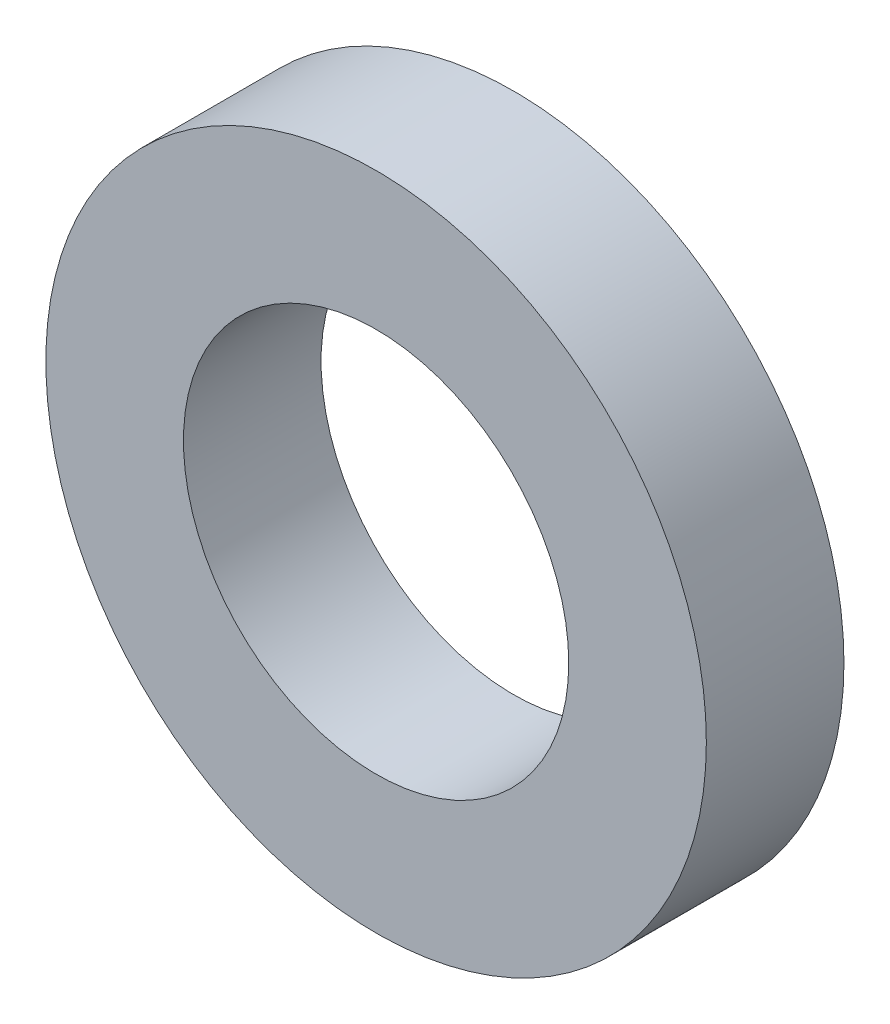
ISO-10303-21;
HEADER;
FILE_DESCRIPTION(('STEP AP214'),'2;1');
FILE_NAME('part.step','',(''),(''),'','','');
FILE_SCHEMA(('AUTOMOTIVE_DESIGN { 1 0 10303 214 1 1 1 1 }'));
ENDSEC;
DATA;
#1=APPLICATION_CONTEXT('core data for automotive mechanical design processes');
#2=APPLICATION_PROTOCOL_DEFINITION('international standard','automotive_design',2000,#1);
#3=PRODUCT_CONTEXT('',#1,'mechanical');
#4=PRODUCT('Part','Part','',(#3));
#5=PRODUCT_RELATED_PRODUCT_CATEGORY('part','',(#4));
#6=PRODUCT_DEFINITION_FORMATION('','',#4);
#7=PRODUCT_DEFINITION_CONTEXT('part definition',#1,'design');
#8=PRODUCT_DEFINITION('design','',#6,#7);
#9=PRODUCT_DEFINITION_SHAPE('','',#8);
#10=(LENGTH_UNIT() NAMED_UNIT(*) SI_UNIT(.MILLI.,.METRE.));
#11=(NAMED_UNIT(*) PLANE_ANGLE_UNIT() SI_UNIT($,.RADIAN.));
#12=(NAMED_UNIT(*) SI_UNIT($,.STERADIAN.) SOLID_ANGLE_UNIT());
#13=UNCERTAINTY_MEASURE_WITH_UNIT(LENGTH_MEASURE(1.E-05),#10,'distance_accuracy_value','');
#14=(GEOMETRIC_REPRESENTATION_CONTEXT(3) GLOBAL_UNCERTAINTY_ASSIGNED_CONTEXT((#13)) GLOBAL_UNIT_ASSIGNED_CONTEXT((#10,
#11,#12)) REPRESENTATION_CONTEXT('',''));
#15=CARTESIAN_POINT('',(0.,0.,0.));
#16=DIRECTION('',(0.,0.,1.));
#17=DIRECTION('',(1.,0.,0.));
#18=AXIS2_PLACEMENT_3D('',#15,#16,#17);
#19=CARTESIAN_POINT('',(0.,0.,1.));
#20=DIRECTION('',(0.,0.,1.));
#21=DIRECTION('',(1.,0.,0.));
#22=AXIS2_PLACEMENT_3D('',#19,#20,#21);
#23=PLANE('',#22);
#24=CARTESIAN_POINT('',(0.,0.,1.));
#25=DIRECTION('',(0.,0.,1.));
#26=DIRECTION('',(1.,0.,0.));
#27=AXIS2_PLACEMENT_3D('',#24,#25,#26);
#28=CIRCLE('',#27,2.4);
#29=CARTESIAN_POINT('',(2.4,0.,1.));
#30=VERTEX_POINT('',#29);
#31=EDGE_CURVE('E10',#30,#30,#28,.T.);
#32=ORIENTED_EDGE('',*,*,#31,.T.);
#33=EDGE_LOOP('',(#32));
#34=FACE_BOUND('',#33,.T.);
#35=CARTESIAN_POINT('',(0.,0.,1.));
#36=DIRECTION('',(0.,0.,1.));
#37=DIRECTION('',(1.,0.,0.));
#38=AXIS2_PLACEMENT_3D('',#35,#36,#37);
#39=CIRCLE('',#38,1.4);
#40=CARTESIAN_POINT('',(1.4,0.,1.));
#41=VERTEX_POINT('',#40);
#42=EDGE_CURVE('E50',#41,#41,#39,.T.);
#43=ORIENTED_EDGE('',*,*,#42,.F.);
#44=EDGE_LOOP('',(#43));
#45=FACE_BOUND('',#44,.T.);
#46=ADVANCED_FACE('F37',(#34,#45),#23,.T.);
#47=CARTESIAN_POINT('',(0.,0.,0.));
#48=DIRECTION('',(0.,0.,1.));
#49=DIRECTION('',(1.,0.,0.));
#50=AXIS2_PLACEMENT_3D('',#47,#48,#49);
#51=PLANE('',#50);
#52=CARTESIAN_POINT('',(0.,0.,0.));
#53=DIRECTION('',(0.,0.,1.));
#54=DIRECTION('',(1.,0.,0.));
#55=AXIS2_PLACEMENT_3D('',#52,#53,#54);
#56=CIRCLE('',#55,2.4);
#57=CARTESIAN_POINT('',(2.4,0.,0.));
#58=VERTEX_POINT('',#57);
#59=EDGE_CURVE('E41',#58,#58,#56,.T.);
#60=ORIENTED_EDGE('',*,*,#59,.F.);
#61=EDGE_LOOP('',(#60));
#62=FACE_BOUND('',#61,.T.);
#63=CARTESIAN_POINT('',(0.,0.,0.));
#64=DIRECTION('',(0.,0.,1.));
#65=DIRECTION('',(1.,0.,0.));
#66=AXIS2_PLACEMENT_3D('',#63,#64,#65);
#67=CIRCLE('',#66,1.4);
#68=CARTESIAN_POINT('',(1.4,0.,0.));
#69=VERTEX_POINT('',#68);
#70=EDGE_CURVE('E52',#69,#69,#67,.T.);
#71=ORIENTED_EDGE('',*,*,#70,.T.);
#72=EDGE_LOOP('',(#71));
#73=FACE_BOUND('',#72,.T.);
#74=ADVANCED_FACE('F64',(#62,#73),#51,.F.);
#75=CARTESIAN_POINT('',(0.,0.,1.));
#76=DIRECTION('',(0.,0.,-1.));
#77=DIRECTION('',(-1.,0.,0.));
#78=AXIS2_PLACEMENT_3D('',#75,#76,#77);
#79=CYLINDRICAL_SURFACE('',#78,2.4);
#80=ORIENTED_EDGE('',*,*,#31,.F.);
#81=EDGE_LOOP('',(#80));
#82=FACE_BOUND('',#81,.T.);
#83=ORIENTED_EDGE('',*,*,#59,.T.);
#84=EDGE_LOOP('',(#83));
#85=FACE_BOUND('',#84,.T.);
#86=ADVANCED_FACE('F39',(#82,#85),#79,.T.);
#87=CARTESIAN_POINT('',(0.,0.,1.));
#88=DIRECTION('',(0.,0.,-1.));
#89=DIRECTION('',(-1.,0.,0.));
#90=AXIS2_PLACEMENT_3D('',#87,#88,#89);
#91=CYLINDRICAL_SURFACE('',#90,1.4);
#92=ORIENTED_EDGE('',*,*,#42,.T.);
#93=EDGE_LOOP('',(#92));
#94=FACE_BOUND('',#93,.T.);
#95=ORIENTED_EDGE('',*,*,#70,.F.);
#96=EDGE_LOOP('',(#95));
#97=FACE_BOUND('',#96,.T.);
#98=ADVANCED_FACE('F60',(#94,#97),#91,.F.);
#99=CLOSED_SHELL('',(#46,#74,#86,#98));
#100=MANIFOLD_SOLID_BREP('B2',#99);
#101=ADVANCED_BREP_SHAPE_REPRESENTATION('',(#18,#100),#14);
#102=SHAPE_DEFINITION_REPRESENTATION(#9,#101);
ENDSEC;
END-ISO-10303-21;
